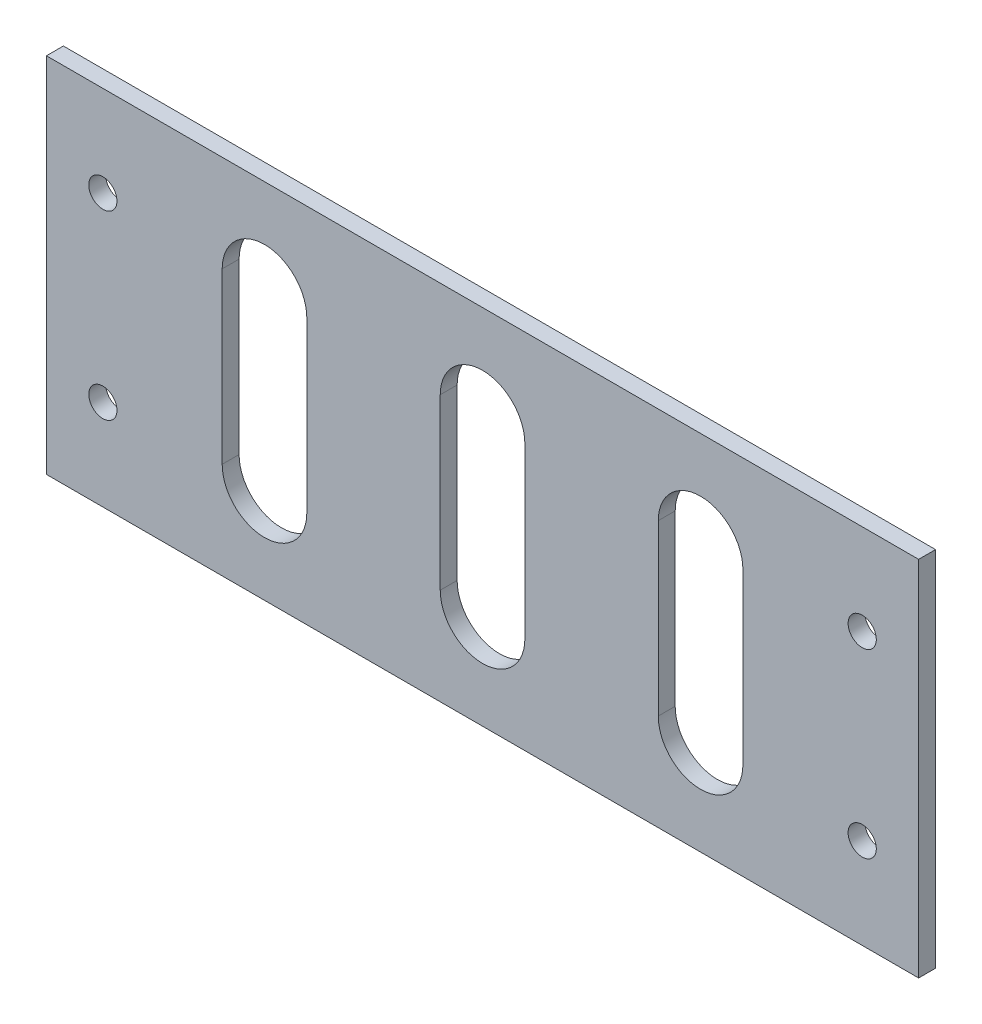
ISO-10303-21;
HEADER;
FILE_DESCRIPTION(('STEP AP214'),'2;1');
FILE_NAME('part.step','',(''),(''),'','','');
FILE_SCHEMA(('AUTOMOTIVE_DESIGN { 1 0 10303 214 1 1 1 1 }'));
ENDSEC;
DATA;
#1=APPLICATION_CONTEXT('core data for automotive mechanical design processes');
#2=APPLICATION_PROTOCOL_DEFINITION('international standard','automotive_design',2000,#1);
#3=PRODUCT_CONTEXT('',#1,'mechanical');
#4=PRODUCT('Part','Part','',(#3));
#5=PRODUCT_RELATED_PRODUCT_CATEGORY('part','',(#4));
#6=PRODUCT_DEFINITION_FORMATION('','',#4);
#7=PRODUCT_DEFINITION_CONTEXT('part definition',#1,'design');
#8=PRODUCT_DEFINITION('design','',#6,#7);
#9=PRODUCT_DEFINITION_SHAPE('','',#8);
#10=(LENGTH_UNIT() NAMED_UNIT(*) SI_UNIT(.MILLI.,.METRE.));
#11=(NAMED_UNIT(*) PLANE_ANGLE_UNIT() SI_UNIT($,.RADIAN.));
#12=(NAMED_UNIT(*) SI_UNIT($,.STERADIAN.) SOLID_ANGLE_UNIT());
#13=UNCERTAINTY_MEASURE_WITH_UNIT(LENGTH_MEASURE(1.E-05),#10,'distance_accuracy_value','');
#14=(GEOMETRIC_REPRESENTATION_CONTEXT(3) GLOBAL_UNCERTAINTY_ASSIGNED_CONTEXT((#13)) GLOBAL_UNIT_ASSIGNED_CONTEXT((#10,
#11,#12)) REPRESENTATION_CONTEXT('',''));
#15=CARTESIAN_POINT('',(0.,0.,0.));
#16=DIRECTION('',(0.,0.,1.));
#17=DIRECTION('',(1.,0.,0.));
#18=AXIS2_PLACEMENT_3D('',#15,#16,#17);
#19=CARTESIAN_POINT('',(0.,0.,0.));
#20=DIRECTION('',(0.,1.,0.));
#21=DIRECTION('',(0.,0.,1.));
#22=AXIS2_PLACEMENT_3D('',#19,#20,#21);
#23=PLANE('',#22);
#24=DIRECTION('',(0.,0.,1.));
#25=VECTOR('',#24,1.);
#26=CARTESIAN_POINT('',(-77.5450548972726,0.,-1.49999999999998));
#27=LINE('',#26,#25);
#28=CARTESIAN_POINT('',(-77.5450548972726,0.,-1.49999999999998));
#29=VERTEX_POINT('',#28);
#30=CARTESIAN_POINT('',(-77.5450548972726,0.,1.50000000000002));
#31=VERTEX_POINT('',#30);
#32=EDGE_CURVE('E291',#29,#31,#27,.T.);
#33=ORIENTED_EDGE('',*,*,#32,.F.);
#34=DIRECTION('',(-1.,0.,0.));
#35=VECTOR('',#34,1.);
#36=CARTESIAN_POINT('',(-77.5450548972726,0.,-1.49999999999998));
#37=LINE('',#36,#35);
#38=CARTESIAN_POINT('',(77.054945102732,0.,-1.49999999999998));
#39=VERTEX_POINT('',#38);
#40=EDGE_CURVE('E309',#39,#29,#37,.T.);
#41=ORIENTED_EDGE('',*,*,#40,.F.);
#42=DIRECTION('',(0.,0.,-1.));
#43=VECTOR('',#42,1.);
#44=CARTESIAN_POINT('',(77.054945102732,0.,-1.49999999999998));
#45=LINE('',#44,#43);
#46=CARTESIAN_POINT('',(77.0549451027321,0.,1.50000000000002));
#47=VERTEX_POINT('',#46);
#48=EDGE_CURVE('E306',#47,#39,#45,.T.);
#49=ORIENTED_EDGE('',*,*,#48,.F.);
#50=DIRECTION('',(1.,0.,0.));
#51=VECTOR('',#50,1.);
#52=CARTESIAN_POINT('',(-77.5450548972726,0.,1.50000000000002));
#53=LINE('',#52,#51);
#54=EDGE_CURVE('E302',#31,#47,#53,.T.);
#55=ORIENTED_EDGE('',*,*,#54,.F.);
#56=EDGE_LOOP('',(#33,#41,#49,#55));
#57=FACE_BOUND('',#56,.T.);
#58=ADVANCED_FACE('F38',(#57),#23,.F.);
#59=CARTESIAN_POINT('',(-77.5450548972726,218.899104634287,-1.49999999999998));
#60=DIRECTION('',(0.,0.,1.));
#61=DIRECTION('',(1.,0.,0.));
#62=AXIS2_PLACEMENT_3D('',#59,#60,#61);
#63=PLANE('',#62);
#64=DIRECTION('',(0.,1.,0.));
#65=VECTOR('',#64,1.);
#66=CARTESIAN_POINT('',(-31.3950548972714,17.135,-1.49999999999998));
#67=LINE('',#66,#65);
#68=CARTESIAN_POINT('',(-31.3950548972714,17.135,-1.49999999999998));
#69=VERTEX_POINT('',#68);
#70=CARTESIAN_POINT('',(-31.3950548972714,47.135,-1.49999999999998));
#71=VERTEX_POINT('',#70);
#72=EDGE_CURVE('E169',#69,#71,#67,.T.);
#73=ORIENTED_EDGE('',*,*,#72,.T.);
#74=CARTESIAN_POINT('',(-38.8950548972714,47.135,-1.49999999999998));
#75=DIRECTION('',(0.,0.,1.));
#76=DIRECTION('',(1.,0.,0.));
#77=AXIS2_PLACEMENT_3D('',#74,#75,#76);
#78=CIRCLE('',#77,7.5);
#79=CARTESIAN_POINT('',(-46.3950548972714,47.135,-1.49999999999998));
#80=VERTEX_POINT('',#79);
#81=EDGE_CURVE('E161',#71,#80,#78,.T.);
#82=ORIENTED_EDGE('',*,*,#81,.T.);
#83=DIRECTION('',(0.,-1.,0.));
#84=VECTOR('',#83,1.);
#85=CARTESIAN_POINT('',(-46.3950548972714,47.135,-1.49999999999998));
#86=LINE('',#85,#84);
#87=CARTESIAN_POINT('',(-46.3950548972714,17.135,-1.49999999999998));
#88=VERTEX_POINT('',#87);
#89=EDGE_CURVE('E172',#80,#88,#86,.T.);
#90=ORIENTED_EDGE('',*,*,#89,.T.);
#91=CARTESIAN_POINT('',(-38.8950548972714,17.135,-1.49999999999998));
#92=DIRECTION('',(0.,0.,1.));
#93=DIRECTION('',(-1.,0.,0.));
#94=AXIS2_PLACEMENT_3D('',#91,#92,#93);
#95=CIRCLE('',#94,7.5);
#96=EDGE_CURVE('E55',#88,#69,#95,.T.);
#97=ORIENTED_EDGE('',*,*,#96,.T.);
#98=EDGE_LOOP('',(#73,#82,#90,#97));
#99=FACE_BOUND('',#98,.T.);
#100=DIRECTION('',(0.,1.,0.));
#101=VECTOR('',#100,1.);
#102=CARTESIAN_POINT('',(7.25494510272972,17.135,-1.49999999999998));
#103=LINE('',#102,#101);
#104=CARTESIAN_POINT('',(7.25494510272972,17.135,-1.49999999999998));
#105=VERTEX_POINT('',#104);
#106=CARTESIAN_POINT('',(7.25494510272972,47.135,-1.49999999999998));
#107=VERTEX_POINT('',#106);
#108=EDGE_CURVE('E211',#105,#107,#103,.T.);
#109=ORIENTED_EDGE('',*,*,#108,.T.);
#110=CARTESIAN_POINT('',(-0.245054897270278,47.135,-1.49999999999998));
#111=DIRECTION('',(0.,0.,1.));
#112=DIRECTION('',(1.,0.,0.));
#113=AXIS2_PLACEMENT_3D('',#110,#111,#112);
#114=CIRCLE('',#113,7.5);
#115=CARTESIAN_POINT('',(-7.74505489727029,47.135,-1.49999999999998));
#116=VERTEX_POINT('',#115);
#117=EDGE_CURVE('E203',#107,#116,#114,.T.);
#118=ORIENTED_EDGE('',*,*,#117,.T.);
#119=DIRECTION('',(0.,-1.,0.));
#120=VECTOR('',#119,1.);
#121=CARTESIAN_POINT('',(-7.74505489727029,47.135,-1.49999999999998));
#122=LINE('',#121,#120);
#123=CARTESIAN_POINT('',(-7.7450548972703,17.135,-1.49999999999998));
#124=VERTEX_POINT('',#123);
#125=EDGE_CURVE('E206',#116,#124,#122,.T.);
#126=ORIENTED_EDGE('',*,*,#125,.T.);
#127=CARTESIAN_POINT('',(-0.245054897270274,17.135,-1.49999999999998));
#128=DIRECTION('',(0.,0.,1.));
#129=DIRECTION('',(-1.,0.,0.));
#130=AXIS2_PLACEMENT_3D('',#127,#128,#129);
#131=CIRCLE('',#130,7.50000000000001);
#132=EDGE_CURVE('E63',#124,#105,#131,.T.);
#133=ORIENTED_EDGE('',*,*,#132,.T.);
#134=EDGE_LOOP('',(#109,#118,#126,#133));
#135=FACE_BOUND('',#134,.T.);
#136=DIRECTION('',(0.,1.,0.));
#137=VECTOR('',#136,1.);
#138=CARTESIAN_POINT('',(45.9049451027309,17.135,-1.49999999999998));
#139=LINE('',#138,#137);
#140=CARTESIAN_POINT('',(45.9049451027309,17.135,-1.49999999999998));
#141=VERTEX_POINT('',#140);
#142=CARTESIAN_POINT('',(45.9049451027309,47.135,-1.49999999999998));
#143=VERTEX_POINT('',#142);
#144=EDGE_CURVE('E243',#141,#143,#139,.T.);
#145=ORIENTED_EDGE('',*,*,#144,.T.);
#146=CARTESIAN_POINT('',(38.4049451027309,47.135,-1.49999999999998));
#147=DIRECTION('',(0.,0.,1.));
#148=DIRECTION('',(1.,0.,0.));
#149=AXIS2_PLACEMENT_3D('',#146,#147,#148);
#150=CIRCLE('',#149,7.50000000000001);
#151=CARTESIAN_POINT('',(30.9049451027309,47.135,-1.49999999999998));
#152=VERTEX_POINT('',#151);
#153=EDGE_CURVE('E233',#143,#152,#150,.T.);
#154=ORIENTED_EDGE('',*,*,#153,.T.);
#155=DIRECTION('',(0.,-1.,0.));
#156=VECTOR('',#155,1.);
#157=CARTESIAN_POINT('',(30.9049451027309,47.135,-1.49999999999998));
#158=LINE('',#157,#156);
#159=CARTESIAN_POINT('',(30.9049451027309,17.135,-1.49999999999998));
#160=VERTEX_POINT('',#159);
#161=EDGE_CURVE('E236',#152,#160,#158,.T.);
#162=ORIENTED_EDGE('',*,*,#161,.T.);
#163=CARTESIAN_POINT('',(38.4049451027309,17.135,-1.49999999999998));
#164=DIRECTION('',(0.,0.,1.));
#165=DIRECTION('',(-1.,0.,0.));
#166=AXIS2_PLACEMENT_3D('',#163,#164,#165);
#167=CIRCLE('',#166,7.50000000000001);
#168=EDGE_CURVE('E240',#160,#141,#167,.T.);
#169=ORIENTED_EDGE('',*,*,#168,.T.);
#170=EDGE_LOOP('',(#145,#154,#162,#169));
#171=FACE_BOUND('',#170,.T.);
#172=CARTESIAN_POINT('',(67.054945102732,16.0675,-1.49999999999998));
#173=DIRECTION('',(0.,0.,1.));
#174=DIRECTION('',(1.,0.,0.));
#175=AXIS2_PLACEMENT_3D('',#172,#173,#174);
#176=CIRCLE('',#175,2.50000000000001);
#177=CARTESIAN_POINT('',(69.5549451027321,16.0675,-1.49999999999998));
#178=VERTEX_POINT('',#177);
#179=EDGE_CURVE('E283',#178,#178,#176,.T.);
#180=ORIENTED_EDGE('',*,*,#179,.T.);
#181=EDGE_LOOP('',(#180));
#182=FACE_BOUND('',#181,.T.);
#183=CARTESIAN_POINT('',(67.054945102732,48.2025,-1.49999999999998));
#184=DIRECTION('',(0.,0.,1.));
#185=DIRECTION('',(1.,0.,0.));
#186=AXIS2_PLACEMENT_3D('',#183,#184,#185);
#187=CIRCLE('',#186,2.50000000000001);
#188=CARTESIAN_POINT('',(69.554945102732,48.2025,-1.49999999999998));
#189=VERTEX_POINT('',#188);
#190=EDGE_CURVE('E275',#189,#189,#187,.T.);
#191=ORIENTED_EDGE('',*,*,#190,.T.);
#192=EDGE_LOOP('',(#191));
#193=FACE_BOUND('',#192,.T.);
#194=CARTESIAN_POINT('',(-67.5450548972726,48.2025,-1.49999999999998));
#195=DIRECTION('',(0.,0.,1.));
#196=DIRECTION('',(1.,0.,0.));
#197=AXIS2_PLACEMENT_3D('',#194,#195,#196);
#198=CIRCLE('',#197,2.5);
#199=CARTESIAN_POINT('',(-65.0450548972726,48.2025,-1.49999999999998));
#200=VERTEX_POINT('',#199);
#201=EDGE_CURVE('E268',#200,#200,#198,.T.);
#202=ORIENTED_EDGE('',*,*,#201,.T.);
#203=EDGE_LOOP('',(#202));
#204=FACE_BOUND('',#203,.T.);
#205=CARTESIAN_POINT('',(-67.5450548972726,16.0675,-1.49999999999998));
#206=DIRECTION('',(0.,0.,1.));
#207=DIRECTION('',(1.,0.,0.));
#208=AXIS2_PLACEMENT_3D('',#205,#206,#207);
#209=CIRCLE('',#208,2.50000000000001);
#210=CARTESIAN_POINT('',(-65.0450548972726,16.0675,-1.49999999999998));
#211=VERTEX_POINT('',#210);
#212=EDGE_CURVE('E288',#211,#211,#209,.T.);
#213=ORIENTED_EDGE('',*,*,#212,.T.);
#214=EDGE_LOOP('',(#213));
#215=FACE_BOUND('',#214,.T.);
#216=DIRECTION('',(0.,-1.,0.));
#217=VECTOR('',#216,1.);
#218=CARTESIAN_POINT('',(-77.5450548972726,218.899104634287,-1.49999999999998));
#219=LINE('',#218,#217);
#220=CARTESIAN_POINT('',(-77.5450548972726,64.27,-1.49999999999998));
#221=VERTEX_POINT('',#220);
#222=EDGE_CURVE('E313',#221,#29,#219,.T.);
#223=ORIENTED_EDGE('',*,*,#222,.F.);
#224=DIRECTION('',(1.,0.,0.));
#225=VECTOR('',#224,1.);
#226=CARTESIAN_POINT('',(-77.5450548972726,64.27,-1.49999999999998));
#227=LINE('',#226,#225);
#228=CARTESIAN_POINT('',(77.054945102732,64.27,-1.49999999999998));
#229=VERTEX_POINT('',#228);
#230=EDGE_CURVE('E42',#221,#229,#227,.T.);
#231=ORIENTED_EDGE('',*,*,#230,.T.);
#232=DIRECTION('',(0.,-1.,0.));
#233=VECTOR('',#232,1.);
#234=CARTESIAN_POINT('',(77.054945102732,218.899104634287,-1.49999999999998));
#235=LINE('',#234,#233);
#236=EDGE_CURVE('E316',#229,#39,#235,.T.);
#237=ORIENTED_EDGE('',*,*,#236,.T.);
#238=ORIENTED_EDGE('',*,*,#40,.T.);
#239=EDGE_LOOP('',(#223,#231,#237,#238));
#240=FACE_BOUND('',#239,.T.);
#241=ADVANCED_FACE('F176',(#99,#135,#171,#182,#193,#204,#215,#240),#63,.F.);
#242=CARTESIAN_POINT('',(77.054945102732,218.899104634287,-1.49999999999998));
#243=DIRECTION('',(-1.,0.,0.));
#244=DIRECTION('',(0.,0.,1.));
#245=AXIS2_PLACEMENT_3D('',#242,#243,#244);
#246=PLANE('',#245);
#247=ORIENTED_EDGE('',*,*,#236,.F.);
#248=DIRECTION('',(0.,0.,1.));
#249=VECTOR('',#248,1.);
#250=CARTESIAN_POINT('',(77.054945102732,64.27,-1.49999999999998));
#251=LINE('',#250,#249);
#252=CARTESIAN_POINT('',(77.0549451027321,64.27,1.50000000000002));
#253=VERTEX_POINT('',#252);
#254=EDGE_CURVE('E294',#229,#253,#251,.T.);
#255=ORIENTED_EDGE('',*,*,#254,.T.);
#256=DIRECTION('',(0.,-1.,0.));
#257=VECTOR('',#256,1.);
#258=CARTESIAN_POINT('',(77.0549451027321,218.899104634287,1.50000000000002));
#259=LINE('',#258,#257);
#260=EDGE_CURVE('E319',#253,#47,#259,.T.);
#261=ORIENTED_EDGE('',*,*,#260,.T.);
#262=ORIENTED_EDGE('',*,*,#48,.T.);
#263=EDGE_LOOP('',(#247,#255,#261,#262));
#264=FACE_BOUND('',#263,.T.);
#265=ADVANCED_FACE('F338',(#264),#246,.F.);
#266=CARTESIAN_POINT('',(-77.5450548972726,218.899104634287,1.50000000000002));
#267=DIRECTION('',(0.,0.,-1.));
#268=DIRECTION('',(-1.,0.,0.));
#269=AXIS2_PLACEMENT_3D('',#266,#267,#268);
#270=PLANE('',#269);
#271=DIRECTION('',(0.,-1.,0.));
#272=VECTOR('',#271,1.);
#273=CARTESIAN_POINT('',(-46.3950548972714,47.135,1.50000000000002));
#274=LINE('',#273,#272);
#275=CARTESIAN_POINT('',(-46.3950548972714,47.135,1.50000000000002));
#276=VERTEX_POINT('',#275);
#277=CARTESIAN_POINT('',(-46.3950548972714,17.135,1.50000000000002));
#278=VERTEX_POINT('',#277);
#279=EDGE_CURVE('E190',#276,#278,#274,.T.);
#280=ORIENTED_EDGE('',*,*,#279,.F.);
#281=CARTESIAN_POINT('',(-38.8950548972714,47.135,1.50000000000002));
#282=DIRECTION('',(0.,0.,1.));
#283=DIRECTION('',(1.,0.,0.));
#284=AXIS2_PLACEMENT_3D('',#281,#282,#283);
#285=CIRCLE('',#284,7.5);
#286=CARTESIAN_POINT('',(-31.3950548972714,47.135,1.50000000000002));
#287=VERTEX_POINT('',#286);
#288=EDGE_CURVE('E164',#287,#276,#285,.T.);
#289=ORIENTED_EDGE('',*,*,#288,.F.);
#290=DIRECTION('',(0.,1.,0.));
#291=VECTOR('',#290,1.);
#292=CARTESIAN_POINT('',(-31.3950548972714,17.135,1.50000000000002));
#293=LINE('',#292,#291);
#294=CARTESIAN_POINT('',(-31.3950548972714,17.135,1.50000000000002));
#295=VERTEX_POINT('',#294);
#296=EDGE_CURVE('E179',#295,#287,#293,.T.);
#297=ORIENTED_EDGE('',*,*,#296,.F.);
#298=CARTESIAN_POINT('',(-38.8950548972714,17.135,1.50000000000002));
#299=DIRECTION('',(0.,0.,1.));
#300=DIRECTION('',(-1.,0.,0.));
#301=AXIS2_PLACEMENT_3D('',#298,#299,#300);
#302=CIRCLE('',#301,7.5);
#303=EDGE_CURVE('E183',#278,#295,#302,.T.);
#304=ORIENTED_EDGE('',*,*,#303,.F.);
#305=EDGE_LOOP('',(#280,#289,#297,#304));
#306=FACE_BOUND('',#305,.T.);
#307=DIRECTION('',(0.,-1.,0.));
#308=VECTOR('',#307,1.);
#309=CARTESIAN_POINT('',(-7.74505489727029,47.135,1.50000000000002));
#310=LINE('',#309,#308);
#311=CARTESIAN_POINT('',(-7.74505489727029,47.135,1.50000000000002));
#312=VERTEX_POINT('',#311);
#313=CARTESIAN_POINT('',(-7.74505489727028,17.135,1.50000000000002));
#314=VERTEX_POINT('',#313);
#315=EDGE_CURVE('E217',#312,#314,#310,.T.);
#316=ORIENTED_EDGE('',*,*,#315,.F.);
#317=CARTESIAN_POINT('',(-0.245054897270278,47.135,1.50000000000002));
#318=DIRECTION('',(0.,0.,1.));
#319=DIRECTION('',(1.,0.,0.));
#320=AXIS2_PLACEMENT_3D('',#317,#318,#319);
#321=CIRCLE('',#320,7.5);
#322=CARTESIAN_POINT('',(7.25494510272972,47.135,1.50000000000002));
#323=VERTEX_POINT('',#322);
#324=EDGE_CURVE('E215',#323,#312,#321,.T.);
#325=ORIENTED_EDGE('',*,*,#324,.F.);
#326=DIRECTION('',(0.,1.,0.));
#327=VECTOR('',#326,1.);
#328=CARTESIAN_POINT('',(7.25494510272972,17.135,1.50000000000002));
#329=LINE('',#328,#327);
#330=CARTESIAN_POINT('',(7.25494510272972,17.135,1.50000000000002));
#331=VERTEX_POINT('',#330);
#332=EDGE_CURVE('E207',#331,#323,#329,.T.);
#333=ORIENTED_EDGE('',*,*,#332,.F.);
#334=CARTESIAN_POINT('',(-0.245054897270274,17.135,1.50000000000002));
#335=DIRECTION('',(0.,0.,1.));
#336=DIRECTION('',(-1.,0.,0.));
#337=AXIS2_PLACEMENT_3D('',#334,#335,#336);
#338=CIRCLE('',#337,7.50000000000001);
#339=EDGE_CURVE('E221',#314,#331,#338,.T.);
#340=ORIENTED_EDGE('',*,*,#339,.F.);
#341=EDGE_LOOP('',(#316,#325,#333,#340));
#342=FACE_BOUND('',#341,.T.);
#343=DIRECTION('',(0.,-1.,0.));
#344=VECTOR('',#343,1.);
#345=CARTESIAN_POINT('',(30.9049451027309,47.135,1.50000000000002));
#346=LINE('',#345,#344);
#347=CARTESIAN_POINT('',(30.9049451027309,47.135,1.50000000000002));
#348=VERTEX_POINT('',#347);
#349=CARTESIAN_POINT('',(30.9049451027309,17.135,1.50000000000002));
#350=VERTEX_POINT('',#349);
#351=EDGE_CURVE('E251',#348,#350,#346,.T.);
#352=ORIENTED_EDGE('',*,*,#351,.F.);
#353=CARTESIAN_POINT('',(38.4049451027309,47.135,1.50000000000002));
#354=DIRECTION('',(0.,0.,1.));
#355=DIRECTION('',(1.,0.,0.));
#356=AXIS2_PLACEMENT_3D('',#353,#354,#355);
#357=CIRCLE('',#356,7.50000000000001);
#358=CARTESIAN_POINT('',(45.9049451027309,47.135,1.50000000000002));
#359=VERTEX_POINT('',#358);
#360=EDGE_CURVE('E248',#359,#348,#357,.T.);
#361=ORIENTED_EDGE('',*,*,#360,.F.);
#362=DIRECTION('',(0.,1.,0.));
#363=VECTOR('',#362,1.);
#364=CARTESIAN_POINT('',(45.9049451027309,17.135,1.50000000000002));
#365=LINE('',#364,#363);
#366=CARTESIAN_POINT('',(45.9049451027309,17.135,1.50000000000002));
#367=VERTEX_POINT('',#366);
#368=EDGE_CURVE('E237',#367,#359,#365,.T.);
#369=ORIENTED_EDGE('',*,*,#368,.F.);
#370=CARTESIAN_POINT('',(38.4049451027309,17.135,1.50000000000002));
#371=DIRECTION('',(0.,0.,1.));
#372=DIRECTION('',(-1.,0.,0.));
#373=AXIS2_PLACEMENT_3D('',#370,#371,#372);
#374=CIRCLE('',#373,7.50000000000001);
#375=EDGE_CURVE('E254',#350,#367,#374,.T.);
#376=ORIENTED_EDGE('',*,*,#375,.F.);
#377=EDGE_LOOP('',(#352,#361,#369,#376));
#378=FACE_BOUND('',#377,.T.);
#379=CARTESIAN_POINT('',(67.054945102732,16.0675,1.50000000000002));
#380=DIRECTION('',(0.,0.,1.));
#381=DIRECTION('',(1.,0.,0.));
#382=AXIS2_PLACEMENT_3D('',#379,#380,#381);
#383=CIRCLE('',#382,2.50000000000001);
#384=CARTESIAN_POINT('',(69.5549451027321,16.0675,1.50000000000002));
#385=VERTEX_POINT('',#384);
#386=EDGE_CURVE('E198',#385,#385,#383,.T.);
#387=ORIENTED_EDGE('',*,*,#386,.F.);
#388=EDGE_LOOP('',(#387));
#389=FACE_BOUND('',#388,.T.);
#390=CARTESIAN_POINT('',(67.054945102732,48.2025,1.50000000000002));
#391=DIRECTION('',(0.,0.,1.));
#392=DIRECTION('',(1.,0.,0.));
#393=AXIS2_PLACEMENT_3D('',#390,#391,#392);
#394=CIRCLE('',#393,2.50000000000001);
#395=CARTESIAN_POINT('',(69.554945102732,48.2025,1.50000000000002));
#396=VERTEX_POINT('',#395);
#397=EDGE_CURVE('E279',#396,#396,#394,.T.);
#398=ORIENTED_EDGE('',*,*,#397,.F.);
#399=EDGE_LOOP('',(#398));
#400=FACE_BOUND('',#399,.T.);
#401=CARTESIAN_POINT('',(-67.5450548972726,48.2025,1.50000000000002));
#402=DIRECTION('',(0.,0.,1.));
#403=DIRECTION('',(1.,0.,0.));
#404=AXIS2_PLACEMENT_3D('',#401,#402,#403);
#405=CIRCLE('',#404,2.5);
#406=CARTESIAN_POINT('',(-65.0450548972726,48.2025,1.50000000000002));
#407=VERTEX_POINT('',#406);
#408=EDGE_CURVE('E272',#407,#407,#405,.T.);
#409=ORIENTED_EDGE('',*,*,#408,.F.);
#410=EDGE_LOOP('',(#409));
#411=FACE_BOUND('',#410,.T.);
#412=CARTESIAN_POINT('',(-67.5450548972726,16.0675,1.50000000000002));
#413=DIRECTION('',(0.,0.,1.));
#414=DIRECTION('',(1.,0.,0.));
#415=AXIS2_PLACEMENT_3D('',#412,#413,#414);
#416=CIRCLE('',#415,2.50000000000001);
#417=CARTESIAN_POINT('',(-65.0450548972726,16.0675,1.50000000000002));
#418=VERTEX_POINT('',#417);
#419=EDGE_CURVE('E271',#418,#418,#416,.T.);
#420=ORIENTED_EDGE('',*,*,#419,.F.);
#421=EDGE_LOOP('',(#420));
#422=FACE_BOUND('',#421,.T.);
#423=ORIENTED_EDGE('',*,*,#260,.F.);
#424=DIRECTION('',(-1.,0.,0.));
#425=VECTOR('',#424,1.);
#426=CARTESIAN_POINT('',(-77.5450548972726,64.27,1.50000000000002));
#427=LINE('',#426,#425);
#428=CARTESIAN_POINT('',(-77.5450548972726,64.27,1.50000000000002));
#429=VERTEX_POINT('',#428);
#430=EDGE_CURVE('E47',#253,#429,#427,.T.);
#431=ORIENTED_EDGE('',*,*,#430,.T.);
#432=DIRECTION('',(0.,-1.,0.));
#433=VECTOR('',#432,1.);
#434=CARTESIAN_POINT('',(-77.5450548972726,218.899104634287,1.50000000000002));
#435=LINE('',#434,#433);
#436=EDGE_CURVE('E321',#429,#31,#435,.T.);
#437=ORIENTED_EDGE('',*,*,#436,.T.);
#438=ORIENTED_EDGE('',*,*,#54,.T.);
#439=EDGE_LOOP('',(#423,#431,#437,#438));
#440=FACE_BOUND('',#439,.T.);
#441=ADVANCED_FACE('F335',(#306,#342,#378,#389,#400,#411,#422,#440),#270,.F.);
#442=CARTESIAN_POINT('',(-77.5450548972726,218.899104634287,-1.49999999999998));
#443=DIRECTION('',(1.,0.,0.));
#444=DIRECTION('',(0.,0.,-1.));
#445=AXIS2_PLACEMENT_3D('',#442,#443,#444);
#446=PLANE('',#445);
#447=ORIENTED_EDGE('',*,*,#436,.F.);
#448=DIRECTION('',(0.,0.,-1.));
#449=VECTOR('',#448,1.);
#450=CARTESIAN_POINT('',(-77.5450548972726,64.27,-1.49999999999998));
#451=LINE('',#450,#449);
#452=EDGE_CURVE('E11',#429,#221,#451,.T.);
#453=ORIENTED_EDGE('',*,*,#452,.T.);
#454=ORIENTED_EDGE('',*,*,#222,.T.);
#455=ORIENTED_EDGE('',*,*,#32,.T.);
#456=EDGE_LOOP('',(#447,#453,#454,#455));
#457=FACE_BOUND('',#456,.T.);
#458=ADVANCED_FACE('F40',(#457),#446,.F.);
#459=CARTESIAN_POINT('',(80.790479008637,64.27,4.96446609409502));
#460=DIRECTION('',(0.,-1.,0.));
#461=DIRECTION('',(1.,0.,0.));
#462=AXIS2_PLACEMENT_3D('',#459,#460,#461);
#463=PLANE('',#462);
#464=ORIENTED_EDGE('',*,*,#430,.F.);
#465=ORIENTED_EDGE('',*,*,#254,.F.);
#466=ORIENTED_EDGE('',*,*,#230,.F.);
#467=ORIENTED_EDGE('',*,*,#452,.F.);
#468=EDGE_LOOP('',(#464,#465,#466,#467));
#469=FACE_BOUND('',#468,.T.);
#470=ADVANCED_FACE('F331',(#469),#463,.F.);
#471=CARTESIAN_POINT('',(-67.5450548972726,16.0675,-1.49999999999998));
#472=DIRECTION('',(0.,0.,1.));
#473=DIRECTION('',(1.,0.,0.));
#474=AXIS2_PLACEMENT_3D('',#471,#472,#473);
#475=CYLINDRICAL_SURFACE('',#474,2.50000000000001);
#476=ORIENTED_EDGE('',*,*,#212,.F.);
#477=EDGE_LOOP('',(#476));
#478=FACE_BOUND('',#477,.T.);
#479=ORIENTED_EDGE('',*,*,#419,.T.);
#480=EDGE_LOOP('',(#479));
#481=FACE_BOUND('',#480,.T.);
#482=ADVANCED_FACE('F374',(#478,#481),#475,.F.);
#483=CARTESIAN_POINT('',(-67.5450548972726,48.2025,-1.49999999999998));
#484=DIRECTION('',(0.,0.,1.));
#485=DIRECTION('',(1.,0.,0.));
#486=AXIS2_PLACEMENT_3D('',#483,#484,#485);
#487=CYLINDRICAL_SURFACE('',#486,2.5);
#488=ORIENTED_EDGE('',*,*,#201,.F.);
#489=EDGE_LOOP('',(#488));
#490=FACE_BOUND('',#489,.T.);
#491=ORIENTED_EDGE('',*,*,#408,.T.);
#492=EDGE_LOOP('',(#491));
#493=FACE_BOUND('',#492,.T.);
#494=ADVANCED_FACE('F376',(#490,#493),#487,.F.);
#495=CARTESIAN_POINT('',(67.054945102732,48.2025,-1.49999999999998));
#496=DIRECTION('',(0.,0.,1.));
#497=DIRECTION('',(1.,0.,0.));
#498=AXIS2_PLACEMENT_3D('',#495,#496,#497);
#499=CYLINDRICAL_SURFACE('',#498,2.50000000000001);
#500=ORIENTED_EDGE('',*,*,#190,.F.);
#501=EDGE_LOOP('',(#500));
#502=FACE_BOUND('',#501,.T.);
#503=ORIENTED_EDGE('',*,*,#397,.T.);
#504=EDGE_LOOP('',(#503));
#505=FACE_BOUND('',#504,.T.);
#506=ADVANCED_FACE('F382',(#502,#505),#499,.F.);
#507=CARTESIAN_POINT('',(67.054945102732,16.0675,-1.49999999999998));
#508=DIRECTION('',(0.,0.,1.));
#509=DIRECTION('',(1.,0.,0.));
#510=AXIS2_PLACEMENT_3D('',#507,#508,#509);
#511=CYLINDRICAL_SURFACE('',#510,2.50000000000001);
#512=ORIENTED_EDGE('',*,*,#179,.F.);
#513=EDGE_LOOP('',(#512));
#514=FACE_BOUND('',#513,.T.);
#515=ORIENTED_EDGE('',*,*,#386,.T.);
#516=EDGE_LOOP('',(#515));
#517=FACE_BOUND('',#516,.T.);
#518=ADVANCED_FACE('F387',(#514,#517),#511,.F.);
#519=CARTESIAN_POINT('',(38.4049451027309,47.135,-1.49999999999998));
#520=DIRECTION('',(0.,0.,1.));
#521=DIRECTION('',(1.,0.,0.));
#522=AXIS2_PLACEMENT_3D('',#519,#520,#521);
#523=CYLINDRICAL_SURFACE('',#522,7.50000000000001);
#524=ORIENTED_EDGE('',*,*,#360,.T.);
#525=DIRECTION('',(0.,0.,1.));
#526=VECTOR('',#525,1.);
#527=CARTESIAN_POINT('',(30.9049451027309,47.135,-1.49999999999998));
#528=LINE('',#527,#526);
#529=EDGE_CURVE('E247',#152,#348,#528,.T.);
#530=ORIENTED_EDGE('',*,*,#529,.F.);
#531=ORIENTED_EDGE('',*,*,#153,.F.);
#532=DIRECTION('',(0.,0.,1.));
#533=VECTOR('',#532,1.);
#534=CARTESIAN_POINT('',(45.9049451027309,47.135,-1.49999999999998));
#535=LINE('',#534,#533);
#536=EDGE_CURVE('E218',#143,#359,#535,.T.);
#537=ORIENTED_EDGE('',*,*,#536,.T.);
#538=EDGE_LOOP('',(#524,#530,#531,#537));
#539=FACE_BOUND('',#538,.T.);
#540=ADVANCED_FACE('F390',(#539),#523,.F.);
#541=CARTESIAN_POINT('',(45.9049451027309,17.135,-1.49999999999998));
#542=DIRECTION('',(1.,0.,0.));
#543=DIRECTION('',(0.,0.,-1.));
#544=AXIS2_PLACEMENT_3D('',#541,#542,#543);
#545=PLANE('',#544);
#546=ORIENTED_EDGE('',*,*,#368,.T.);
#547=ORIENTED_EDGE('',*,*,#536,.F.);
#548=ORIENTED_EDGE('',*,*,#144,.F.);
#549=DIRECTION('',(0.,0.,1.));
#550=VECTOR('',#549,1.);
#551=CARTESIAN_POINT('',(45.9049451027309,17.135,-1.49999999999998));
#552=LINE('',#551,#550);
#553=EDGE_CURVE('E262',#141,#367,#552,.T.);
#554=ORIENTED_EDGE('',*,*,#553,.T.);
#555=EDGE_LOOP('',(#546,#547,#548,#554));
#556=FACE_BOUND('',#555,.T.);
#557=ADVANCED_FACE('F397',(#556),#545,.F.);
#558=CARTESIAN_POINT('',(38.4049451027309,17.135,-1.49999999999998));
#559=DIRECTION('',(0.,0.,1.));
#560=DIRECTION('',(1.,0.,0.));
#561=AXIS2_PLACEMENT_3D('',#558,#559,#560);
#562=CYLINDRICAL_SURFACE('',#561,7.50000000000001);
#563=ORIENTED_EDGE('',*,*,#375,.T.);
#564=ORIENTED_EDGE('',*,*,#553,.F.);
#565=ORIENTED_EDGE('',*,*,#168,.F.);
#566=DIRECTION('',(0.,0.,1.));
#567=VECTOR('',#566,1.);
#568=CARTESIAN_POINT('',(30.9049451027309,17.135,-1.49999999999998));
#569=LINE('',#568,#567);
#570=EDGE_CURVE('E264',#160,#350,#569,.T.);
#571=ORIENTED_EDGE('',*,*,#570,.T.);
#572=EDGE_LOOP('',(#563,#564,#565,#571));
#573=FACE_BOUND('',#572,.T.);
#574=ADVANCED_FACE('F403',(#573),#562,.F.);
#575=CARTESIAN_POINT('',(30.9049451027309,47.135,-1.49999999999998));
#576=DIRECTION('',(-1.,0.,0.));
#577=DIRECTION('',(0.,-1.,0.));
#578=AXIS2_PLACEMENT_3D('',#575,#576,#577);
#579=PLANE('',#578);
#580=ORIENTED_EDGE('',*,*,#351,.T.);
#581=ORIENTED_EDGE('',*,*,#570,.F.);
#582=ORIENTED_EDGE('',*,*,#161,.F.);
#583=ORIENTED_EDGE('',*,*,#529,.T.);
#584=EDGE_LOOP('',(#580,#581,#582,#583));
#585=FACE_BOUND('',#584,.T.);
#586=ADVANCED_FACE('F399',(#585),#579,.F.);
#587=CARTESIAN_POINT('',(-0.245054897270278,47.135,-1.49999999999998));
#588=DIRECTION('',(0.,0.,1.));
#589=DIRECTION('',(1.,0.,0.));
#590=AXIS2_PLACEMENT_3D('',#587,#588,#589);
#591=CYLINDRICAL_SURFACE('',#590,7.5);
#592=ORIENTED_EDGE('',*,*,#324,.T.);
#593=DIRECTION('',(0.,0.,1.));
#594=VECTOR('',#593,1.);
#595=CARTESIAN_POINT('',(-7.74505489727029,47.135,-1.49999999999998));
#596=LINE('',#595,#594);
#597=EDGE_CURVE('E214',#116,#312,#596,.T.);
#598=ORIENTED_EDGE('',*,*,#597,.F.);
#599=ORIENTED_EDGE('',*,*,#117,.F.);
#600=DIRECTION('',(0.,0.,1.));
#601=VECTOR('',#600,1.);
#602=CARTESIAN_POINT('',(7.25494510272972,47.135,-1.49999999999998));
#603=LINE('',#602,#601);
#604=EDGE_CURVE('E191',#107,#323,#603,.T.);
#605=ORIENTED_EDGE('',*,*,#604,.T.);
#606=EDGE_LOOP('',(#592,#598,#599,#605));
#607=FACE_BOUND('',#606,.T.);
#608=ADVANCED_FACE('F402',(#607),#591,.F.);
#609=CARTESIAN_POINT('',(7.25494510272972,17.135,-1.49999999999998));
#610=DIRECTION('',(1.,0.,0.));
#611=DIRECTION('',(0.,0.,-1.));
#612=AXIS2_PLACEMENT_3D('',#609,#610,#611);
#613=PLANE('',#612);
#614=ORIENTED_EDGE('',*,*,#332,.T.);
#615=ORIENTED_EDGE('',*,*,#604,.F.);
#616=ORIENTED_EDGE('',*,*,#108,.F.);
#617=DIRECTION('',(0.,0.,1.));
#618=VECTOR('',#617,1.);
#619=CARTESIAN_POINT('',(7.25494510272972,17.135,-1.49999999999998));
#620=LINE('',#619,#618);
#621=EDGE_CURVE('E227',#105,#331,#620,.T.);
#622=ORIENTED_EDGE('',*,*,#621,.T.);
#623=EDGE_LOOP('',(#614,#615,#616,#622));
#624=FACE_BOUND('',#623,.T.);
#625=ADVANCED_FACE('F413',(#624),#613,.F.);
#626=CARTESIAN_POINT('',(-0.245054897270274,17.135,-1.49999999999998));
#627=DIRECTION('',(0.,0.,1.));
#628=DIRECTION('',(1.,0.,0.));
#629=AXIS2_PLACEMENT_3D('',#626,#627,#628);
#630=CYLINDRICAL_SURFACE('',#629,7.50000000000001);
#631=ORIENTED_EDGE('',*,*,#339,.T.);
#632=ORIENTED_EDGE('',*,*,#621,.F.);
#633=ORIENTED_EDGE('',*,*,#132,.F.);
#634=DIRECTION('',(0.,0.,1.));
#635=VECTOR('',#634,1.);
#636=CARTESIAN_POINT('',(-7.74505489727028,17.135,-1.49999999999998));
#637=LINE('',#636,#635);
#638=EDGE_CURVE('E229',#124,#314,#637,.T.);
#639=ORIENTED_EDGE('',*,*,#638,.T.);
#640=EDGE_LOOP('',(#631,#632,#633,#639));
#641=FACE_BOUND('',#640,.T.);
#642=ADVANCED_FACE('F418',(#641),#630,.F.);
#643=CARTESIAN_POINT('',(-7.74505489727029,47.135,-1.49999999999998));
#644=DIRECTION('',(-1.,0.,0.));
#645=DIRECTION('',(0.,-1.,0.));
#646=AXIS2_PLACEMENT_3D('',#643,#644,#645);
#647=PLANE('',#646);
#648=ORIENTED_EDGE('',*,*,#315,.T.);
#649=ORIENTED_EDGE('',*,*,#638,.F.);
#650=ORIENTED_EDGE('',*,*,#125,.F.);
#651=ORIENTED_EDGE('',*,*,#597,.T.);
#652=EDGE_LOOP('',(#648,#649,#650,#651));
#653=FACE_BOUND('',#652,.T.);
#654=ADVANCED_FACE('F415',(#653),#647,.F.);
#655=CARTESIAN_POINT('',(-38.8950548972714,47.135,-1.49999999999998));
#656=DIRECTION('',(0.,0.,1.));
#657=DIRECTION('',(1.,0.,0.));
#658=AXIS2_PLACEMENT_3D('',#655,#656,#657);
#659=CYLINDRICAL_SURFACE('',#658,7.5);
#660=ORIENTED_EDGE('',*,*,#288,.T.);
#661=DIRECTION('',(0.,0.,1.));
#662=VECTOR('',#661,1.);
#663=CARTESIAN_POINT('',(-46.3950548972714,47.135,-1.49999999999998));
#664=LINE('',#663,#662);
#665=EDGE_CURVE('E157',#80,#276,#664,.T.);
#666=ORIENTED_EDGE('',*,*,#665,.F.);
#667=ORIENTED_EDGE('',*,*,#81,.F.);
#668=DIRECTION('',(0.,0.,1.));
#669=VECTOR('',#668,1.);
#670=CARTESIAN_POINT('',(-31.3950548972714,47.135,-1.49999999999998));
#671=LINE('',#670,#669);
#672=EDGE_CURVE('E196',#71,#287,#671,.T.);
#673=ORIENTED_EDGE('',*,*,#672,.T.);
#674=EDGE_LOOP('',(#660,#666,#667,#673));
#675=FACE_BOUND('',#674,.T.);
#676=ADVANCED_FACE('F159',(#675),#659,.F.);
#677=CARTESIAN_POINT('',(-31.3950548972714,17.135,-1.49999999999998));
#678=DIRECTION('',(1.,0.,0.));
#679=DIRECTION('',(0.,0.,-1.));
#680=AXIS2_PLACEMENT_3D('',#677,#678,#679);
#681=PLANE('',#680);
#682=ORIENTED_EDGE('',*,*,#296,.T.);
#683=ORIENTED_EDGE('',*,*,#672,.F.);
#684=ORIENTED_EDGE('',*,*,#72,.F.);
#685=DIRECTION('',(0.,0.,1.));
#686=VECTOR('',#685,1.);
#687=CARTESIAN_POINT('',(-31.3950548972714,17.135,-1.49999999999998));
#688=LINE('',#687,#686);
#689=EDGE_CURVE('E199',#69,#295,#688,.T.);
#690=ORIENTED_EDGE('',*,*,#689,.T.);
#691=EDGE_LOOP('',(#682,#683,#684,#690));
#692=FACE_BOUND('',#691,.T.);
#693=ADVANCED_FACE('F427',(#692),#681,.F.);
#694=CARTESIAN_POINT('',(-38.8950548972714,17.135,-1.49999999999998));
#695=DIRECTION('',(0.,0.,1.));
#696=DIRECTION('',(1.,0.,0.));
#697=AXIS2_PLACEMENT_3D('',#694,#695,#696);
#698=CYLINDRICAL_SURFACE('',#697,7.5);
#699=ORIENTED_EDGE('',*,*,#303,.T.);
#700=ORIENTED_EDGE('',*,*,#689,.F.);
#701=ORIENTED_EDGE('',*,*,#96,.F.);
#702=DIRECTION('',(0.,0.,1.));
#703=VECTOR('',#702,1.);
#704=CARTESIAN_POINT('',(-46.3950548972714,17.135,-1.49999999999998));
#705=LINE('',#704,#703);
#706=EDGE_CURVE('E168',#88,#278,#705,.T.);
#707=ORIENTED_EDGE('',*,*,#706,.T.);
#708=EDGE_LOOP('',(#699,#700,#701,#707));
#709=FACE_BOUND('',#708,.T.);
#710=ADVANCED_FACE('F430',(#709),#698,.F.);
#711=CARTESIAN_POINT('',(-46.3950548972714,47.135,-1.49999999999998));
#712=DIRECTION('',(-1.,0.,0.));
#713=DIRECTION('',(0.,-1.,0.));
#714=AXIS2_PLACEMENT_3D('',#711,#712,#713);
#715=PLANE('',#714);
#716=ORIENTED_EDGE('',*,*,#279,.T.);
#717=ORIENTED_EDGE('',*,*,#706,.F.);
#718=ORIENTED_EDGE('',*,*,#89,.F.);
#719=ORIENTED_EDGE('',*,*,#665,.T.);
#720=EDGE_LOOP('',(#716,#717,#718,#719));
#721=FACE_BOUND('',#720,.T.);
#722=ADVANCED_FACE('F173',(#721),#715,.F.);
#723=CLOSED_SHELL('',(#58,#241,#265,#441,#458,#470,#482,#494,#506,#518,#540,#557,#574,#586,#608,
#625,#642,#654,#676,#693,#710,#722));
#724=MANIFOLD_SOLID_BREP('B2',#723);
#725=ADVANCED_BREP_SHAPE_REPRESENTATION('',(#18,#724),#14);
#726=SHAPE_DEFINITION_REPRESENTATION(#9,#725);
ENDSEC;
END-ISO-10303-21;
